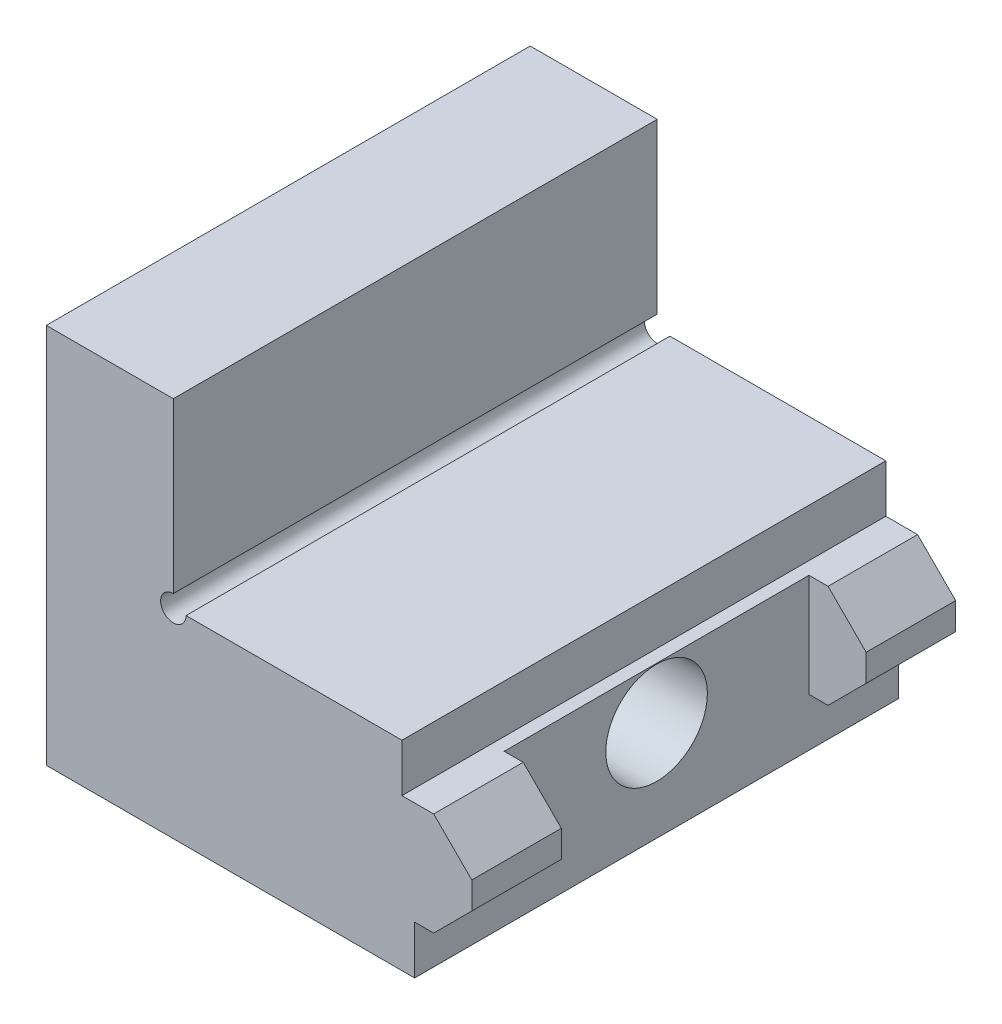
ISO-10303-21;
HEADER;
FILE_DESCRIPTION(('STEP AP214'),'2;1');
FILE_NAME('part.step','',(''),(''),'','','');
FILE_SCHEMA(('AUTOMOTIVE_DESIGN { 1 0 10303 214 1 1 1 1 }'));
ENDSEC;
DATA;
#1=APPLICATION_CONTEXT('core data for automotive mechanical design processes');
#2=APPLICATION_PROTOCOL_DEFINITION('international standard','automotive_design',2000,#1);
#3=PRODUCT_CONTEXT('',#1,'mechanical');
#4=PRODUCT('Part','Part','',(#3));
#5=PRODUCT_RELATED_PRODUCT_CATEGORY('part','',(#4));
#6=PRODUCT_DEFINITION_FORMATION('','',#4);
#7=PRODUCT_DEFINITION_CONTEXT('part definition',#1,'design');
#8=PRODUCT_DEFINITION('design','',#6,#7);
#9=PRODUCT_DEFINITION_SHAPE('','',#8);
#10=(LENGTH_UNIT() NAMED_UNIT(*) SI_UNIT(.MILLI.,.METRE.));
#11=(NAMED_UNIT(*) PLANE_ANGLE_UNIT() SI_UNIT($,.RADIAN.));
#12=(NAMED_UNIT(*) SI_UNIT($,.STERADIAN.) SOLID_ANGLE_UNIT());
#13=UNCERTAINTY_MEASURE_WITH_UNIT(LENGTH_MEASURE(1.E-05),#10,'distance_accuracy_value','');
#14=(GEOMETRIC_REPRESENTATION_CONTEXT(3) GLOBAL_UNCERTAINTY_ASSIGNED_CONTEXT((#13)) GLOBAL_UNIT_ASSIGNED_CONTEXT((#10,
#11,#12)) REPRESENTATION_CONTEXT('',''));
#15=CARTESIAN_POINT('',(0.,0.,0.));
#16=DIRECTION('',(0.,0.,1.));
#17=DIRECTION('',(1.,0.,0.));
#18=AXIS2_PLACEMENT_3D('',#15,#16,#17);
#19=CARTESIAN_POINT('',(0.,-3.77996102445055,-38.1));
#20=DIRECTION('',(0.,-1.,0.));
#21=DIRECTION('',(0.,0.,-1.));
#22=AXIS2_PLACEMENT_3D('',#19,#20,#21);
#23=PLANE('',#22);
#24=DIRECTION('',(-1.,0.,0.));
#25=VECTOR('',#24,1.);
#26=CARTESIAN_POINT('',(0.,-3.77996102445055,-31.05));
#27=LINE('',#26,#25);
#28=CARTESIAN_POINT('',(20.5,-3.77996102445055,-31.05));
#29=VERTEX_POINT('',#28);
#30=CARTESIAN_POINT('',(19.,-3.77996102445055,-31.05));
#31=VERTEX_POINT('',#30);
#32=EDGE_CURVE('E202',#29,#31,#27,.T.);
#33=ORIENTED_EDGE('',*,*,#32,.F.);
#34=DIRECTION('',(0.,0.,-1.));
#35=VECTOR('',#34,1.);
#36=CARTESIAN_POINT('',(20.5,-3.77996102445055,-38.1));
#37=LINE('',#36,#35);
#38=CARTESIAN_POINT('',(20.5,-3.77996102445055,-38.1));
#39=VERTEX_POINT('',#38);
#40=EDGE_CURVE('E11',#29,#39,#37,.T.);
#41=ORIENTED_EDGE('',*,*,#40,.T.);
#42=DIRECTION('',(1.,0.,0.));
#43=VECTOR('',#42,1.);
#44=CARTESIAN_POINT('',(0.,-3.77996102445055,-38.1));
#45=LINE('',#44,#43);
#46=CARTESIAN_POINT('',(18.,-3.77996102445055,-38.1));
#47=VERTEX_POINT('',#46);
#48=EDGE_CURVE('E227',#47,#39,#45,.T.);
#49=ORIENTED_EDGE('',*,*,#48,.F.);
#50=DIRECTION('',(0.,0.,1.));
#51=VECTOR('',#50,1.);
#52=CARTESIAN_POINT('',(18.,-3.77996102445055,-38.1));
#53=LINE('',#52,#51);
#54=CARTESIAN_POINT('',(18.,-3.77996102445055,0.));
#55=VERTEX_POINT('',#54);
#56=EDGE_CURVE('E265',#47,#55,#53,.T.);
#57=ORIENTED_EDGE('',*,*,#56,.T.);
#58=DIRECTION('',(1.,0.,0.));
#59=VECTOR('',#58,1.);
#60=CARTESIAN_POINT('',(0.,-3.77996102445055,0.));
#61=LINE('',#60,#59);
#62=CARTESIAN_POINT('',(20.5,-3.77996102445055,0.));
#63=VERTEX_POINT('',#62);
#64=EDGE_CURVE('E253',#55,#63,#61,.T.);
#65=ORIENTED_EDGE('',*,*,#64,.T.);
#66=DIRECTION('',(0.,0.,-1.));
#67=VECTOR('',#66,1.);
#68=CARTESIAN_POINT('',(20.5,-3.77996102445055,-38.1));
#69=LINE('',#68,#67);
#70=CARTESIAN_POINT('',(20.5,-3.77996102445055,-7.05));
#71=VERTEX_POINT('',#70);
#72=EDGE_CURVE('E45',#63,#71,#69,.T.);
#73=ORIENTED_EDGE('',*,*,#72,.T.);
#74=DIRECTION('',(1.,0.,0.));
#75=VECTOR('',#74,1.);
#76=CARTESIAN_POINT('',(0.,-3.77996102445055,-7.05));
#77=LINE('',#76,#75);
#78=CARTESIAN_POINT('',(19.,-3.77996102445055,-7.05));
#79=VERTEX_POINT('',#78);
#80=EDGE_CURVE('E187',#79,#71,#77,.T.);
#81=ORIENTED_EDGE('',*,*,#80,.F.);
#82=DIRECTION('',(0.,0.,1.));
#83=VECTOR('',#82,1.);
#84=CARTESIAN_POINT('',(19.,-3.77996102445055,-38.1));
#85=LINE('',#84,#83);
#86=EDGE_CURVE('E171',#31,#79,#85,.T.);
#87=ORIENTED_EDGE('',*,*,#86,.F.);
#88=EDGE_LOOP('',(#33,#41,#49,#57,#65,#73,#81,#87));
#89=FACE_BOUND('',#88,.T.);
#90=ADVANCED_FACE('F37',(#89),#23,.F.);
#91=CARTESIAN_POINT('',(23.5,0.,-38.1));
#92=DIRECTION('',(-1.,0.,0.));
#93=DIRECTION('',(0.,-1.,0.));
#94=AXIS2_PLACEMENT_3D('',#91,#92,#93);
#95=PLANE('',#94);
#96=DIRECTION('',(0.,1.,0.));
#97=VECTOR('',#96,1.);
#98=CARTESIAN_POINT('',(23.5,0.,-31.05));
#99=LINE('',#98,#97);
#100=CARTESIAN_POINT('',(23.5,-8.89996102445055,-31.05));
#101=VERTEX_POINT('',#100);
#102=CARTESIAN_POINT('',(23.5,-6.77996102445056,-31.05));
#103=VERTEX_POINT('',#102);
#104=EDGE_CURVE('E195',#101,#103,#99,.T.);
#105=ORIENTED_EDGE('',*,*,#104,.F.);
#106=DIRECTION('',(0.,0.,-1.));
#107=VECTOR('',#106,1.);
#108=CARTESIAN_POINT('',(23.5,-8.89996102445055,-38.1));
#109=LINE('',#108,#107);
#110=CARTESIAN_POINT('',(23.5,-8.89996102445055,-38.1));
#111=VERTEX_POINT('',#110);
#112=EDGE_CURVE('E299',#101,#111,#109,.T.);
#113=ORIENTED_EDGE('',*,*,#112,.T.);
#114=DIRECTION('',(0.,-1.,0.));
#115=VECTOR('',#114,1.);
#116=CARTESIAN_POINT('',(23.5,0.,-38.1));
#117=LINE('',#116,#115);
#118=CARTESIAN_POINT('',(23.5,-6.77996102445056,-38.1));
#119=VERTEX_POINT('',#118);
#120=EDGE_CURVE('E224',#119,#111,#117,.T.);
#121=ORIENTED_EDGE('',*,*,#120,.F.);
#122=DIRECTION('',(0.,0.,1.));
#123=VECTOR('',#122,1.);
#124=CARTESIAN_POINT('',(23.5,-6.77996102445056,-38.1));
#125=LINE('',#124,#123);
#126=EDGE_CURVE('E296',#119,#103,#125,.T.);
#127=ORIENTED_EDGE('',*,*,#126,.T.);
#128=EDGE_LOOP('',(#105,#113,#121,#127));
#129=FACE_BOUND('',#128,.T.);
#130=ADVANCED_FACE('F390',(#129),#95,.F.);
#131=DIRECTION('',(0.,-1.,0.));
#132=VECTOR('',#131,1.);
#133=CARTESIAN_POINT('',(23.5,0.,0.));
#134=LINE('',#133,#132);
#135=CARTESIAN_POINT('',(23.5,-6.77996102445056,0.));
#136=VERTEX_POINT('',#135);
#137=CARTESIAN_POINT('',(23.5,-8.89996102445055,0.));
#138=VERTEX_POINT('',#137);
#139=EDGE_CURVE('E251',#136,#138,#134,.T.);
#140=ORIENTED_EDGE('',*,*,#139,.T.);
#141=DIRECTION('',(0.,0.,-1.));
#142=VECTOR('',#141,1.);
#143=CARTESIAN_POINT('',(23.5,-8.89996102445055,-38.1));
#144=LINE('',#143,#142);
#145=CARTESIAN_POINT('',(23.5,-8.89996102445055,-7.05));
#146=VERTEX_POINT('',#145);
#147=EDGE_CURVE('E59',#138,#146,#144,.T.);
#148=ORIENTED_EDGE('',*,*,#147,.T.);
#149=DIRECTION('',(0.,-1.,0.));
#150=VECTOR('',#149,1.);
#151=CARTESIAN_POINT('',(23.5,0.,-7.05));
#152=LINE('',#151,#150);
#153=CARTESIAN_POINT('',(23.5,-6.77996102445056,-7.05));
#154=VERTEX_POINT('',#153);
#155=EDGE_CURVE('E192',#154,#146,#152,.T.);
#156=ORIENTED_EDGE('',*,*,#155,.F.);
#157=DIRECTION('',(0.,0.,1.));
#158=VECTOR('',#157,1.);
#159=CARTESIAN_POINT('',(23.5,-6.77996102445056,-38.1));
#160=LINE('',#159,#158);
#161=EDGE_CURVE('E312',#154,#136,#160,.T.);
#162=ORIENTED_EDGE('',*,*,#161,.T.);
#163=EDGE_LOOP('',(#140,#148,#156,#162));
#164=FACE_BOUND('',#163,.T.);
#165=ADVANCED_FACE('F330',(#164),#95,.F.);
#166=CARTESIAN_POINT('',(0.,-11.8999610244505,-38.1));
#167=DIRECTION('',(0.,1.,0.));
#168=DIRECTION('',(0.,0.,1.));
#169=AXIS2_PLACEMENT_3D('',#166,#167,#168);
#170=PLANE('',#169);
#171=DIRECTION('',(-1.,0.,0.));
#172=VECTOR('',#171,1.);
#173=CARTESIAN_POINT('',(0.,-11.8999610244505,-38.1));
#174=LINE('',#173,#172);
#175=CARTESIAN_POINT('',(20.5,-11.8999610244505,-38.1));
#176=VERTEX_POINT('',#175);
#177=CARTESIAN_POINT('',(19.,-11.8999610244505,-38.1));
#178=VERTEX_POINT('',#177);
#179=EDGE_CURVE('E222',#176,#178,#174,.T.);
#180=ORIENTED_EDGE('',*,*,#179,.F.);
#181=DIRECTION('',(0.,0.,1.));
#182=VECTOR('',#181,1.);
#183=CARTESIAN_POINT('',(20.5,-11.8999610244505,-38.1));
#184=LINE('',#183,#182);
#185=CARTESIAN_POINT('',(20.5,-11.8999610244505,-31.05));
#186=VERTEX_POINT('',#185);
#187=EDGE_CURVE('E261',#176,#186,#184,.T.);
#188=ORIENTED_EDGE('',*,*,#187,.T.);
#189=DIRECTION('',(1.,0.,0.));
#190=VECTOR('',#189,1.);
#191=CARTESIAN_POINT('',(0.,-11.8999610244505,-31.05));
#192=LINE('',#191,#190);
#193=CARTESIAN_POINT('',(19.,-11.8999610244505,-31.05));
#194=VERTEX_POINT('',#193);
#195=EDGE_CURVE('E191',#194,#186,#192,.T.);
#196=ORIENTED_EDGE('',*,*,#195,.F.);
#197=DIRECTION('',(0.,0.,1.));
#198=VECTOR('',#197,1.);
#199=CARTESIAN_POINT('',(19.,-11.8999610244505,-38.1));
#200=LINE('',#199,#198);
#201=EDGE_CURVE('E268',#178,#194,#200,.T.);
#202=ORIENTED_EDGE('',*,*,#201,.F.);
#203=EDGE_LOOP('',(#180,#188,#196,#202));
#204=FACE_BOUND('',#203,.T.);
#205=ADVANCED_FACE('F378',(#204),#170,.F.);
#206=DIRECTION('',(-1.,0.,0.));
#207=VECTOR('',#206,1.);
#208=CARTESIAN_POINT('',(0.,-11.8999610244505,-7.05));
#209=LINE('',#208,#207);
#210=CARTESIAN_POINT('',(20.5,-11.8999610244505,-7.05));
#211=VERTEX_POINT('',#210);
#212=CARTESIAN_POINT('',(19.,-11.8999610244505,-7.05000000000001));
#213=VERTEX_POINT('',#212);
#214=EDGE_CURVE('E182',#211,#213,#209,.T.);
#215=ORIENTED_EDGE('',*,*,#214,.F.);
#216=DIRECTION('',(0.,0.,1.));
#217=VECTOR('',#216,1.);
#218=CARTESIAN_POINT('',(20.5,-11.8999610244505,-38.1));
#219=LINE('',#218,#217);
#220=CARTESIAN_POINT('',(20.5,-11.8999610244505,0.));
#221=VERTEX_POINT('',#220);
#222=EDGE_CURVE('E305',#211,#221,#219,.T.);
#223=ORIENTED_EDGE('',*,*,#222,.T.);
#224=DIRECTION('',(-1.,0.,0.));
#225=VECTOR('',#224,1.);
#226=CARTESIAN_POINT('',(0.,-11.8999610244505,0.));
#227=LINE('',#226,#225);
#228=CARTESIAN_POINT('',(19.,-11.8999610244505,0.));
#229=VERTEX_POINT('',#228);
#230=EDGE_CURVE('E249',#221,#229,#227,.T.);
#231=ORIENTED_EDGE('',*,*,#230,.T.);
#232=EDGE_CURVE('E270',#213,#229,#200,.T.);
#233=ORIENTED_EDGE('',*,*,#232,.F.);
#234=EDGE_LOOP('',(#215,#223,#231,#233));
#235=FACE_BOUND('',#234,.T.);
#236=ADVANCED_FACE('F323',(#235),#170,.F.);
#237=CARTESIAN_POINT('',(-30.,-7.83996102445054,-19.05));
#238=DIRECTION('',(1.,0.,0.));
#239=DIRECTION('',(0.,0.,-1.));
#240=AXIS2_PLACEMENT_3D('',#237,#238,#239);
#241=CYLINDRICAL_SURFACE('',#240,4.);
#242=CARTESIAN_POINT('',(0.,-7.83996102445054,-19.05));
#243=DIRECTION('',(1.,0.,0.));
#244=DIRECTION('',(0.,0.,-1.));
#245=AXIS2_PLACEMENT_3D('',#242,#243,#244);
#246=CIRCLE('',#245,4.);
#247=CARTESIAN_POINT('',(0.,-7.83996102445054,-23.05));
#248=VERTEX_POINT('',#247);
#249=EDGE_CURVE('E207',#248,#248,#246,.F.);
#250=ORIENTED_EDGE('',*,*,#249,.T.);
#251=EDGE_LOOP('',(#250));
#252=FACE_BOUND('',#251,.T.);
#253=CARTESIAN_POINT('',(19.,-7.83996102445054,-19.05));
#254=DIRECTION('',(1.,0.,0.));
#255=DIRECTION('',(0.,1.,0.));
#256=AXIS2_PLACEMENT_3D('',#253,#254,#255);
#257=CIRCLE('',#256,4.);
#258=CARTESIAN_POINT('',(19.,-3.83996102445054,-19.05));
#259=VERTEX_POINT('',#258);
#260=EDGE_CURVE('E183',#259,#259,#257,.F.);
#261=ORIENTED_EDGE('',*,*,#260,.F.);
#262=EDGE_LOOP('',(#261));
#263=FACE_BOUND('',#262,.T.);
#264=ADVANCED_FACE('F425',(#252,#263),#241,.F.);
#265=CARTESIAN_POINT('',(0.,0.,-38.1));
#266=DIRECTION('',(0.,0.,1.));
#267=DIRECTION('',(1.,0.,0.));
#268=AXIS2_PLACEMENT_3D('',#265,#266,#267);
#269=CYLINDRICAL_SURFACE('',#268,1.);
#270=CARTESIAN_POINT('',(0.,0.,0.));
#271=DIRECTION('',(0.,0.,1.));
#272=DIRECTION('',(1.,0.,0.));
#273=AXIS2_PLACEMENT_3D('',#270,#271,#272);
#274=CIRCLE('',#273,1.);
#275=CARTESIAN_POINT('',(0.,1.,0.));
#276=VERTEX_POINT('',#275);
#277=CARTESIAN_POINT('',(1.,0.,0.));
#278=VERTEX_POINT('',#277);
#279=EDGE_CURVE('E235',#276,#278,#274,.T.);
#280=ORIENTED_EDGE('',*,*,#279,.T.);
#281=DIRECTION('',(0.,0.,1.));
#282=VECTOR('',#281,1.);
#283=CARTESIAN_POINT('',(1.,0.,-38.1));
#284=LINE('',#283,#282);
#285=CARTESIAN_POINT('',(1.,0.,-38.1));
#286=VERTEX_POINT('',#285);
#287=EDGE_CURVE('E258',#286,#278,#284,.T.);
#288=ORIENTED_EDGE('',*,*,#287,.F.);
#289=CARTESIAN_POINT('',(0.,0.,-38.1));
#290=DIRECTION('',(0.,0.,1.));
#291=DIRECTION('',(1.,0.,0.));
#292=AXIS2_PLACEMENT_3D('',#289,#290,#291);
#293=CIRCLE('',#292,1.);
#294=CARTESIAN_POINT('',(0.,1.,-38.1));
#295=VERTEX_POINT('',#294);
#296=EDGE_CURVE('E208',#295,#286,#293,.T.);
#297=ORIENTED_EDGE('',*,*,#296,.F.);
#298=DIRECTION('',(0.,0.,1.));
#299=VECTOR('',#298,1.);
#300=CARTESIAN_POINT('',(0.,1.,-38.1));
#301=LINE('',#300,#299);
#302=EDGE_CURVE('E234',#295,#276,#301,.T.);
#303=ORIENTED_EDGE('',*,*,#302,.T.);
#304=EDGE_LOOP('',(#280,#288,#297,#303));
#305=FACE_BOUND('',#304,.T.);
#306=ADVANCED_FACE('F348',(#305),#269,.F.);
#307=CARTESIAN_POINT('',(0.,0.,-38.1));
#308=DIRECTION('',(0.,-1.,0.));
#309=DIRECTION('',(0.,0.,-1.));
#310=AXIS2_PLACEMENT_3D('',#307,#308,#309);
#311=PLANE('',#310);
#312=DIRECTION('',(1.,0.,0.));
#313=VECTOR('',#312,1.);
#314=CARTESIAN_POINT('',(0.,0.,0.));
#315=LINE('',#314,#313);
#316=CARTESIAN_POINT('',(18.,0.,0.));
#317=VERTEX_POINT('',#316);
#318=EDGE_CURVE('E212',#278,#317,#315,.T.);
#319=ORIENTED_EDGE('',*,*,#318,.T.);
#320=DIRECTION('',(0.,0.,1.));
#321=VECTOR('',#320,1.);
#322=CARTESIAN_POINT('',(18.,0.,-38.1));
#323=LINE('',#322,#321);
#324=CARTESIAN_POINT('',(18.,0.,-38.1));
#325=VERTEX_POINT('',#324);
#326=EDGE_CURVE('E262',#325,#317,#323,.T.);
#327=ORIENTED_EDGE('',*,*,#326,.F.);
#328=DIRECTION('',(1.,0.,0.));
#329=VECTOR('',#328,1.);
#330=CARTESIAN_POINT('',(0.,0.,-38.1));
#331=LINE('',#330,#329);
#332=EDGE_CURVE('E232',#286,#325,#331,.T.);
#333=ORIENTED_EDGE('',*,*,#332,.F.);
#334=ORIENTED_EDGE('',*,*,#287,.T.);
#335=EDGE_LOOP('',(#319,#327,#333,#334));
#336=FACE_BOUND('',#335,.T.);
#337=ADVANCED_FACE('F345',(#336),#311,.F.);
#338=CARTESIAN_POINT('',(18.,0.,-38.1));
#339=DIRECTION('',(-1.,0.,0.));
#340=DIRECTION('',(0.,-1.,0.));
#341=AXIS2_PLACEMENT_3D('',#338,#339,#340);
#342=PLANE('',#341);
#343=DIRECTION('',(0.,-1.,0.));
#344=VECTOR('',#343,1.);
#345=CARTESIAN_POINT('',(18.,0.,0.));
#346=LINE('',#345,#344);
#347=EDGE_CURVE('E255',#317,#55,#346,.T.);
#348=ORIENTED_EDGE('',*,*,#347,.T.);
#349=ORIENTED_EDGE('',*,*,#56,.F.);
#350=DIRECTION('',(0.,-1.,0.));
#351=VECTOR('',#350,1.);
#352=CARTESIAN_POINT('',(18.,0.,-38.1));
#353=LINE('',#352,#351);
#354=EDGE_CURVE('E230',#325,#47,#353,.T.);
#355=ORIENTED_EDGE('',*,*,#354,.F.);
#356=ORIENTED_EDGE('',*,*,#326,.T.);
#357=EDGE_LOOP('',(#348,#349,#355,#356));
#358=FACE_BOUND('',#357,.T.);
#359=ADVANCED_FACE('F339',(#358),#342,.F.);
#360=CARTESIAN_POINT('',(19.,0.,-38.1));
#361=DIRECTION('',(-1.,0.,0.));
#362=DIRECTION('',(0.,-1.,0.));
#363=AXIS2_PLACEMENT_3D('',#360,#361,#362);
#364=PLANE('',#363);
#365=DIRECTION('',(0.,-1.,0.));
#366=VECTOR('',#365,1.);
#367=CARTESIAN_POINT('',(19.,0.,0.));
#368=LINE('',#367,#366);
#369=CARTESIAN_POINT('',(19.,-15.7149610244505,0.));
#370=VERTEX_POINT('',#369);
#371=EDGE_CURVE('E247',#229,#370,#368,.T.);
#372=ORIENTED_EDGE('',*,*,#371,.T.);
#373=DIRECTION('',(0.,0.,1.));
#374=VECTOR('',#373,1.);
#375=CARTESIAN_POINT('',(19.,-15.7149610244505,-38.1));
#376=LINE('',#375,#374);
#377=CARTESIAN_POINT('',(19.,-15.7149610244505,-38.1));
#378=VERTEX_POINT('',#377);
#379=EDGE_CURVE('E271',#378,#370,#376,.T.);
#380=ORIENTED_EDGE('',*,*,#379,.F.);
#381=DIRECTION('',(0.,-1.,0.));
#382=VECTOR('',#381,1.);
#383=CARTESIAN_POINT('',(19.,0.,-38.1));
#384=LINE('',#383,#382);
#385=EDGE_CURVE('E220',#178,#378,#384,.T.);
#386=ORIENTED_EDGE('',*,*,#385,.F.);
#387=ORIENTED_EDGE('',*,*,#201,.T.);
#388=DIRECTION('',(0.,1.,0.));
#389=VECTOR('',#388,1.);
#390=CARTESIAN_POINT('',(19.,0.,-31.05));
#391=LINE('',#390,#389);
#392=EDGE_CURVE('E180',#194,#31,#391,.T.);
#393=ORIENTED_EDGE('',*,*,#392,.T.);
#394=ORIENTED_EDGE('',*,*,#86,.T.);
#395=DIRECTION('',(0.,-1.,0.));
#396=VECTOR('',#395,1.);
#397=CARTESIAN_POINT('',(19.,0.,-7.05));
#398=LINE('',#397,#396);
#399=EDGE_CURVE('E177',#79,#213,#398,.T.);
#400=ORIENTED_EDGE('',*,*,#399,.T.);
#401=ORIENTED_EDGE('',*,*,#232,.T.);
#402=EDGE_LOOP('',(#372,#380,#386,#387,#393,#394,#400,#401));
#403=FACE_BOUND('',#402,.T.);
#404=ORIENTED_EDGE('',*,*,#260,.T.);
#405=EDGE_LOOP('',(#404));
#406=FACE_BOUND('',#405,.T.);
#407=ADVANCED_FACE('F174',(#403,#406),#364,.F.);
#408=CARTESIAN_POINT('',(0.,-15.7149610244506,-38.1));
#409=DIRECTION('',(0.,1.,0.));
#410=DIRECTION('',(-1.,0.,0.));
#411=AXIS2_PLACEMENT_3D('',#408,#409,#410);
#412=PLANE('',#411);
#413=DIRECTION('',(-1.,0.,0.));
#414=VECTOR('',#413,1.);
#415=CARTESIAN_POINT('',(0.,-15.7149610244506,0.));
#416=LINE('',#415,#414);
#417=CARTESIAN_POINT('',(-10.,-15.7149610244506,0.));
#418=VERTEX_POINT('',#417);
#419=EDGE_CURVE('E245',#370,#418,#416,.T.);
#420=ORIENTED_EDGE('',*,*,#419,.T.);
#421=DIRECTION('',(0.,0.,1.));
#422=VECTOR('',#421,1.);
#423=CARTESIAN_POINT('',(-10.,-15.7149610244506,-38.1));
#424=LINE('',#423,#422);
#425=CARTESIAN_POINT('',(-10.,-15.7149610244506,-38.1));
#426=VERTEX_POINT('',#425);
#427=EDGE_CURVE('E273',#426,#418,#424,.T.);
#428=ORIENTED_EDGE('',*,*,#427,.F.);
#429=DIRECTION('',(-1.,0.,0.));
#430=VECTOR('',#429,1.);
#431=CARTESIAN_POINT('',(0.,-15.7149610244506,-38.1));
#432=LINE('',#431,#430);
#433=EDGE_CURVE('E218',#378,#426,#432,.T.);
#434=ORIENTED_EDGE('',*,*,#433,.F.);
#435=ORIENTED_EDGE('',*,*,#379,.T.);
#436=EDGE_LOOP('',(#420,#428,#434,#435));
#437=FACE_BOUND('',#436,.T.);
#438=ADVANCED_FACE('F367',(#437),#412,.F.);
#439=CARTESIAN_POINT('',(-10.,0.,-38.1));
#440=DIRECTION('',(1.,0.,0.));
#441=DIRECTION('',(0.,0.,-1.));
#442=AXIS2_PLACEMENT_3D('',#439,#440,#441);
#443=PLANE('',#442);
#444=CARTESIAN_POINT('',(-10.,-7.83996102445054,-19.05));
#445=DIRECTION('',(1.,0.,0.));
#446=DIRECTION('',(0.,0.,-1.));
#447=AXIS2_PLACEMENT_3D('',#444,#445,#446);
#448=CIRCLE('',#447,6.5);
#449=CARTESIAN_POINT('',(-10.,-7.83996102445054,-25.55));
#450=VERTEX_POINT('',#449);
#451=EDGE_CURVE('E239',#450,#450,#448,.T.);
#452=ORIENTED_EDGE('',*,*,#451,.T.);
#453=EDGE_LOOP('',(#452));
#454=FACE_BOUND('',#453,.T.);
#455=DIRECTION('',(0.,1.,0.));
#456=VECTOR('',#455,1.);
#457=CARTESIAN_POINT('',(-10.,0.,0.));
#458=LINE('',#457,#456);
#459=CARTESIAN_POINT('',(-10.,14.2850389755494,0.));
#460=VERTEX_POINT('',#459);
#461=EDGE_CURVE('E243',#418,#460,#458,.T.);
#462=ORIENTED_EDGE('',*,*,#461,.T.);
#463=DIRECTION('',(0.,0.,1.));
#464=VECTOR('',#463,1.);
#465=CARTESIAN_POINT('',(-10.,14.2850389755494,-38.1));
#466=LINE('',#465,#464);
#467=CARTESIAN_POINT('',(-10.,14.2850389755494,-38.1));
#468=VERTEX_POINT('',#467);
#469=EDGE_CURVE('E276',#468,#460,#466,.T.);
#470=ORIENTED_EDGE('',*,*,#469,.F.);
#471=DIRECTION('',(0.,1.,0.));
#472=VECTOR('',#471,1.);
#473=CARTESIAN_POINT('',(-10.,0.,-38.1));
#474=LINE('',#473,#472);
#475=EDGE_CURVE('E216',#426,#468,#474,.T.);
#476=ORIENTED_EDGE('',*,*,#475,.F.);
#477=ORIENTED_EDGE('',*,*,#427,.T.);
#478=EDGE_LOOP('',(#462,#470,#476,#477));
#479=FACE_BOUND('',#478,.T.);
#480=ADVANCED_FACE('F363',(#454,#479),#443,.F.);
#481=CARTESIAN_POINT('',(0.,14.2850389755494,-38.1));
#482=DIRECTION('',(0.,-1.,0.));
#483=DIRECTION('',(0.,0.,-1.));
#484=AXIS2_PLACEMENT_3D('',#481,#482,#483);
#485=PLANE('',#484);
#486=DIRECTION('',(1.,0.,0.));
#487=VECTOR('',#486,1.);
#488=CARTESIAN_POINT('',(0.,14.2850389755494,0.));
#489=LINE('',#488,#487);
#490=CARTESIAN_POINT('',(0.,14.2850389755494,0.));
#491=VERTEX_POINT('',#490);
#492=EDGE_CURVE('E241',#460,#491,#489,.T.);
#493=ORIENTED_EDGE('',*,*,#492,.T.);
#494=DIRECTION('',(0.,0.,1.));
#495=VECTOR('',#494,1.);
#496=CARTESIAN_POINT('',(0.,14.2850389755494,-38.1));
#497=LINE('',#496,#495);
#498=CARTESIAN_POINT('',(0.,14.2850389755494,-38.1));
#499=VERTEX_POINT('',#498);
#500=EDGE_CURVE('E279',#499,#491,#497,.T.);
#501=ORIENTED_EDGE('',*,*,#500,.F.);
#502=DIRECTION('',(1.,0.,0.));
#503=VECTOR('',#502,1.);
#504=CARTESIAN_POINT('',(0.,14.2850389755494,-38.1));
#505=LINE('',#504,#503);
#506=EDGE_CURVE('E214',#468,#499,#505,.T.);
#507=ORIENTED_EDGE('',*,*,#506,.F.);
#508=ORIENTED_EDGE('',*,*,#469,.T.);
#509=EDGE_LOOP('',(#493,#501,#507,#508));
#510=FACE_BOUND('',#509,.T.);
#511=ADVANCED_FACE('F358',(#510),#485,.F.);
#512=CARTESIAN_POINT('',(0.,0.,-38.1));
#513=DIRECTION('',(-1.,0.,0.));
#514=DIRECTION('',(0.,-1.,0.));
#515=AXIS2_PLACEMENT_3D('',#512,#513,#514);
#516=PLANE('',#515);
#517=DIRECTION('',(0.,-1.,0.));
#518=VECTOR('',#517,1.);
#519=CARTESIAN_POINT('',(0.,0.,0.));
#520=LINE('',#519,#518);
#521=EDGE_CURVE('E238',#491,#276,#520,.T.);
#522=ORIENTED_EDGE('',*,*,#521,.T.);
#523=ORIENTED_EDGE('',*,*,#302,.F.);
#524=DIRECTION('',(0.,-1.,0.));
#525=VECTOR('',#524,1.);
#526=CARTESIAN_POINT('',(0.,0.,-38.1));
#527=LINE('',#526,#525);
#528=EDGE_CURVE('E211',#499,#295,#527,.T.);
#529=ORIENTED_EDGE('',*,*,#528,.F.);
#530=ORIENTED_EDGE('',*,*,#500,.T.);
#531=EDGE_LOOP('',(#522,#523,#529,#530));
#532=FACE_BOUND('',#531,.T.);
#533=ADVANCED_FACE('F352',(#532),#516,.F.);
#534=CARTESIAN_POINT('',(0.,0.,-38.1));
#535=DIRECTION('',(0.,0.,1.));
#536=DIRECTION('',(1.,0.,0.));
#537=AXIS2_PLACEMENT_3D('',#534,#535,#536);
#538=PLANE('',#537);
#539=ORIENTED_EDGE('',*,*,#120,.T.);
#540=DIRECTION('',(0.707106781186547,0.707106781186548,0.));
#541=VECTOR('',#540,1.);
#542=CARTESIAN_POINT('',(20.5,-11.8999610244505,-38.1));
#543=LINE('',#542,#541);
#544=EDGE_CURVE('E303',#111,#176,#543,.F.);
#545=ORIENTED_EDGE('',*,*,#544,.T.);
#546=ORIENTED_EDGE('',*,*,#179,.T.);
#547=ORIENTED_EDGE('',*,*,#385,.T.);
#548=ORIENTED_EDGE('',*,*,#433,.T.);
#549=ORIENTED_EDGE('',*,*,#475,.T.);
#550=ORIENTED_EDGE('',*,*,#506,.T.);
#551=ORIENTED_EDGE('',*,*,#528,.T.);
#552=ORIENTED_EDGE('',*,*,#296,.T.);
#553=ORIENTED_EDGE('',*,*,#332,.T.);
#554=ORIENTED_EDGE('',*,*,#354,.T.);
#555=ORIENTED_EDGE('',*,*,#48,.T.);
#556=DIRECTION('',(-0.707106781186549,0.707106781186546,0.));
#557=VECTOR('',#556,1.);
#558=CARTESIAN_POINT('',(23.5,-6.77996102445056,-38.1));
#559=LINE('',#558,#557);
#560=EDGE_CURVE('E301',#39,#119,#559,.F.);
#561=ORIENTED_EDGE('',*,*,#560,.T.);
#562=EDGE_LOOP('',(#539,#545,#546,#547,#548,#549,#550,#551,#552,#553,#554,#555,#561));
#563=FACE_BOUND('',#562,.T.);
#564=ADVANCED_FACE('F372',(#563),#538,.F.);
#565=CARTESIAN_POINT('',(0.,0.,0.));
#566=DIRECTION('',(0.,0.,1.));
#567=DIRECTION('',(1.,0.,0.));
#568=AXIS2_PLACEMENT_3D('',#565,#566,#567);
#569=PLANE('',#568);
#570=ORIENTED_EDGE('',*,*,#230,.F.);
#571=DIRECTION('',(-0.707106781186547,-0.707106781186548,0.));
#572=VECTOR('',#571,1.);
#573=CARTESIAN_POINT('',(16.1999805122253,-16.1999805122253,0.));
#574=LINE('',#573,#572);
#575=EDGE_CURVE('E310',#221,#138,#574,.F.);
#576=ORIENTED_EDGE('',*,*,#575,.T.);
#577=ORIENTED_EDGE('',*,*,#139,.F.);
#578=DIRECTION('',(0.707106781186549,-0.707106781186546,0.));
#579=VECTOR('',#578,1.);
#580=CARTESIAN_POINT('',(8.36001948777468,8.36001948777471,0.));
#581=LINE('',#580,#579);
#582=EDGE_CURVE('E308',#136,#63,#581,.F.);
#583=ORIENTED_EDGE('',*,*,#582,.T.);
#584=ORIENTED_EDGE('',*,*,#64,.F.);
#585=ORIENTED_EDGE('',*,*,#347,.F.);
#586=ORIENTED_EDGE('',*,*,#318,.F.);
#587=ORIENTED_EDGE('',*,*,#279,.F.);
#588=ORIENTED_EDGE('',*,*,#521,.F.);
#589=ORIENTED_EDGE('',*,*,#492,.F.);
#590=ORIENTED_EDGE('',*,*,#461,.F.);
#591=ORIENTED_EDGE('',*,*,#419,.F.);
#592=ORIENTED_EDGE('',*,*,#371,.F.);
#593=EDGE_LOOP('',(#570,#576,#577,#583,#584,#585,#586,#587,#588,#589,#590,#591,#592));
#594=FACE_BOUND('',#593,.T.);
#595=ADVANCED_FACE('F328',(#594),#569,.T.);
#596=CARTESIAN_POINT('',(-18.2,-7.83996102445054,-19.05));
#597=DIRECTION('',(1.,0.,0.));
#598=DIRECTION('',(0.,0.,-1.));
#599=AXIS2_PLACEMENT_3D('',#596,#597,#598);
#600=CYLINDRICAL_SURFACE('',#599,6.5);
#601=CARTESIAN_POINT('',(0.,-7.83996102445054,-19.05));
#602=DIRECTION('',(1.,0.,0.));
#603=DIRECTION('',(0.,0.,-1.));
#604=AXIS2_PLACEMENT_3D('',#601,#602,#603);
#605=CIRCLE('',#604,6.5);
#606=CARTESIAN_POINT('',(0.,-7.83996102445054,-25.55));
#607=VERTEX_POINT('',#606);
#608=EDGE_CURVE('E204',#607,#607,#605,.T.);
#609=ORIENTED_EDGE('',*,*,#608,.T.);
#610=EDGE_LOOP('',(#609));
#611=FACE_BOUND('',#610,.T.);
#612=ORIENTED_EDGE('',*,*,#451,.F.);
#613=EDGE_LOOP('',(#612));
#614=FACE_BOUND('',#613,.T.);
#615=ADVANCED_FACE('F438',(#611,#614),#600,.F.);
#616=CARTESIAN_POINT('',(0.,-7.83996102445054,-19.05));
#617=DIRECTION('',(1.,0.,0.));
#618=DIRECTION('',(0.,0.,-1.));
#619=AXIS2_PLACEMENT_3D('',#616,#617,#618);
#620=PLANE('',#619);
#621=ORIENTED_EDGE('',*,*,#608,.F.);
#622=EDGE_LOOP('',(#621));
#623=FACE_BOUND('',#622,.T.);
#624=ORIENTED_EDGE('',*,*,#249,.F.);
#625=EDGE_LOOP('',(#624));
#626=FACE_BOUND('',#625,.T.);
#627=ADVANCED_FACE('F446',(#623,#626),#620,.F.);
#628=CARTESIAN_POINT('',(29.,0.,-31.05));
#629=DIRECTION('',(0.,0.,1.));
#630=DIRECTION('',(0.,-1.,0.));
#631=AXIS2_PLACEMENT_3D('',#628,#629,#630);
#632=PLANE('',#631);
#633=ORIENTED_EDGE('',*,*,#195,.T.);
#634=DIRECTION('',(-0.707106781186547,-0.707106781186548,0.));
#635=VECTOR('',#634,1.);
#636=CARTESIAN_POINT('',(30.6999805122253,-1.69998051222527,-31.05));
#637=LINE('',#636,#635);
#638=EDGE_CURVE('E294',#186,#101,#637,.F.);
#639=ORIENTED_EDGE('',*,*,#638,.T.);
#640=ORIENTED_EDGE('',*,*,#104,.T.);
#641=DIRECTION('',(0.707106781186549,-0.707106781186546,0.));
#642=VECTOR('',#641,1.);
#643=CARTESIAN_POINT('',(22.8600194877747,-6.1399805122253,-31.05));
#644=LINE('',#643,#642);
#645=EDGE_CURVE('E292',#103,#29,#644,.F.);
#646=ORIENTED_EDGE('',*,*,#645,.T.);
#647=ORIENTED_EDGE('',*,*,#32,.T.);
#648=ORIENTED_EDGE('',*,*,#392,.F.);
#649=EDGE_LOOP('',(#633,#639,#640,#646,#647,#648));
#650=FACE_BOUND('',#649,.T.);
#651=ADVANCED_FACE('F380',(#650),#632,.T.);
#652=CARTESIAN_POINT('',(29.,0.,-7.05));
#653=DIRECTION('',(0.,0.,-1.));
#654=DIRECTION('',(0.,1.,0.));
#655=AXIS2_PLACEMENT_3D('',#652,#653,#654);
#656=PLANE('',#655);
#657=ORIENTED_EDGE('',*,*,#155,.T.);
#658=DIRECTION('',(0.707106781186547,0.707106781186548,0.));
#659=VECTOR('',#658,1.);
#660=CARTESIAN_POINT('',(30.6999805122253,-1.69998051222527,-7.05));
#661=LINE('',#660,#659);
#662=EDGE_CURVE('E318',#146,#211,#661,.F.);
#663=ORIENTED_EDGE('',*,*,#662,.T.);
#664=ORIENTED_EDGE('',*,*,#214,.T.);
#665=ORIENTED_EDGE('',*,*,#399,.F.);
#666=ORIENTED_EDGE('',*,*,#80,.T.);
#667=DIRECTION('',(-0.707106781186549,0.707106781186546,0.));
#668=VECTOR('',#667,1.);
#669=CARTESIAN_POINT('',(22.8600194877747,-6.13998051222531,-7.05));
#670=LINE('',#669,#668);
#671=EDGE_CURVE('E316',#71,#154,#670,.F.);
#672=ORIENTED_EDGE('',*,*,#671,.T.);
#673=EDGE_LOOP('',(#657,#663,#664,#665,#666,#672));
#674=FACE_BOUND('',#673,.T.);
#675=ADVANCED_FACE('F186',(#674),#656,.T.);
#676=CARTESIAN_POINT('',(20.5,-11.8999610244505,-38.1));
#677=DIRECTION('',(-0.707106781186548,0.707106781186547,0.));
#678=DIRECTION('',(0.,0.,1.));
#679=AXIS2_PLACEMENT_3D('',#676,#677,#678);
#680=PLANE('',#679);
#681=ORIENTED_EDGE('',*,*,#544,.F.);
#682=ORIENTED_EDGE('',*,*,#112,.F.);
#683=ORIENTED_EDGE('',*,*,#638,.F.);
#684=ORIENTED_EDGE('',*,*,#187,.F.);
#685=EDGE_LOOP('',(#681,#682,#683,#684));
#686=FACE_BOUND('',#685,.T.);
#687=ADVANCED_FACE('F393',(#686),#680,.F.);
#688=CARTESIAN_POINT('',(20.5,-11.8999610244505,-38.1));
#689=DIRECTION('',(-0.707106781186548,0.707106781186547,0.));
#690=DIRECTION('',(0.,0.,1.));
#691=AXIS2_PLACEMENT_3D('',#688,#689,#690);
#692=PLANE('',#691);
#693=ORIENTED_EDGE('',*,*,#662,.F.);
#694=ORIENTED_EDGE('',*,*,#147,.F.);
#695=ORIENTED_EDGE('',*,*,#575,.F.);
#696=ORIENTED_EDGE('',*,*,#222,.F.);
#697=EDGE_LOOP('',(#693,#694,#695,#696));
#698=FACE_BOUND('',#697,.T.);
#699=ADVANCED_FACE('F325',(#698),#692,.F.);
#700=CARTESIAN_POINT('',(23.5,-6.77996102445056,-38.1));
#701=DIRECTION('',(-0.707106781186546,-0.707106781186549,0.));
#702=DIRECTION('',(0.,0.,1.));
#703=AXIS2_PLACEMENT_3D('',#700,#701,#702);
#704=PLANE('',#703);
#705=ORIENTED_EDGE('',*,*,#560,.F.);
#706=ORIENTED_EDGE('',*,*,#40,.F.);
#707=ORIENTED_EDGE('',*,*,#645,.F.);
#708=ORIENTED_EDGE('',*,*,#126,.F.);
#709=EDGE_LOOP('',(#705,#706,#707,#708));
#710=FACE_BOUND('',#709,.T.);
#711=ADVANCED_FACE('F386',(#710),#704,.F.);
#712=CARTESIAN_POINT('',(23.5,-6.77996102445056,-38.1));
#713=DIRECTION('',(-0.707106781186546,-0.707106781186549,0.));
#714=DIRECTION('',(0.,0.,1.));
#715=AXIS2_PLACEMENT_3D('',#712,#713,#714);
#716=PLANE('',#715);
#717=ORIENTED_EDGE('',*,*,#671,.F.);
#718=ORIENTED_EDGE('',*,*,#72,.F.);
#719=ORIENTED_EDGE('',*,*,#582,.F.);
#720=ORIENTED_EDGE('',*,*,#161,.F.);
#721=EDGE_LOOP('',(#717,#718,#719,#720));
#722=FACE_BOUND('',#721,.T.);
#723=ADVANCED_FACE('F39',(#722),#716,.F.);
#724=CLOSED_SHELL('',(#90,#130,#165,#205,#236,#264,#306,#337,#359,#407,#438,#480,#511,#533,#564,
#595,#615,#627,#651,#675,#687,#699,#711,#723));
#725=MANIFOLD_SOLID_BREP('B2',#724);
#726=ADVANCED_BREP_SHAPE_REPRESENTATION('',(#18,#725),#14);
#727=SHAPE_DEFINITION_REPRESENTATION(#9,#726);
ENDSEC;
END-ISO-10303-21;
